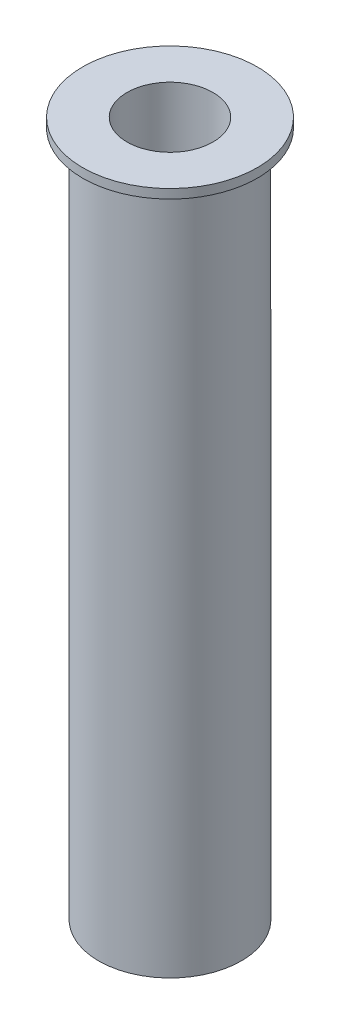
ISO-10303-21;
HEADER;
FILE_DESCRIPTION(('STEP AP214'),'2;1');
FILE_NAME('part.step','',(''),(''),'','','');
FILE_SCHEMA(('AUTOMOTIVE_DESIGN { 1 0 10303 214 1 1 1 1 }'));
ENDSEC;
DATA;
#1=APPLICATION_CONTEXT('core data for automotive mechanical design processes');
#2=APPLICATION_PROTOCOL_DEFINITION('international standard','automotive_design',2000,#1);
#3=PRODUCT_CONTEXT('',#1,'mechanical');
#4=PRODUCT('Part','Part','',(#3));
#5=PRODUCT_RELATED_PRODUCT_CATEGORY('part','',(#4));
#6=PRODUCT_DEFINITION_FORMATION('','',#4);
#7=PRODUCT_DEFINITION_CONTEXT('part definition',#1,'design');
#8=PRODUCT_DEFINITION('design','',#6,#7);
#9=PRODUCT_DEFINITION_SHAPE('','',#8);
#10=(LENGTH_UNIT() NAMED_UNIT(*) SI_UNIT(.MILLI.,.METRE.));
#11=(NAMED_UNIT(*) PLANE_ANGLE_UNIT() SI_UNIT($,.RADIAN.));
#12=(NAMED_UNIT(*) SI_UNIT($,.STERADIAN.) SOLID_ANGLE_UNIT());
#13=UNCERTAINTY_MEASURE_WITH_UNIT(LENGTH_MEASURE(1.E-05),#10,'distance_accuracy_value','');
#14=(GEOMETRIC_REPRESENTATION_CONTEXT(3) GLOBAL_UNCERTAINTY_ASSIGNED_CONTEXT((#13)) GLOBAL_UNIT_ASSIGNED_CONTEXT((#10,
#11,#12)) REPRESENTATION_CONTEXT('',''));
#15=CARTESIAN_POINT('',(0.,0.,0.));
#16=DIRECTION('',(0.,0.,1.));
#17=DIRECTION('',(1.,0.,0.));
#18=AXIS2_PLACEMENT_3D('',#15,#16,#17);
#19=CARTESIAN_POINT('',(0.,22.606,0.));
#20=DIRECTION('',(0.,-1.,0.));
#21=DIRECTION('',(0.,0.,-1.));
#22=AXIS2_PLACEMENT_3D('',#19,#20,#21);
#23=CYLINDRICAL_SURFACE('',#22,1.9812);
#24=CARTESIAN_POINT('',(0.,22.1060655575158,1.9812));
#25=CARTESIAN_POINT('',(0.259338466578053,22.1060655575158,1.9812));
#26=CARTESIAN_POINT('',(0.518574914937336,22.1060655575158,1.92963466434577));
#27=CARTESIAN_POINT('',(0.997769917466095,22.1060655575158,1.73114559527695));
#28=CARTESIAN_POINT('',(1.21753996654691,22.1060655575158,1.58429994322666));
#29=CARTESIAN_POINT('',(1.58429994322666,22.1060655575158,1.21753996654691));
#30=CARTESIAN_POINT('',(1.73114559527701,22.1060655575158,0.99776991746596));
#31=CARTESIAN_POINT('',(1.92963466434572,22.1060655575158,0.51857491493747));
#32=CARTESIAN_POINT('',(1.9812,22.1060655575158,0.259338466578004));
#33=CARTESIAN_POINT('',(1.9812,22.1060655575158,-0.259338466578004));
#34=CARTESIAN_POINT('',(1.92963466434574,22.1060655575158,-0.518574914937414));
#35=CARTESIAN_POINT('',(1.73114559527698,22.1060655575158,-0.997769917466019));
#36=CARTESIAN_POINT('',(1.58429994322661,22.1060655575158,-1.21753996654697));
#37=CARTESIAN_POINT('',(1.21753996654697,22.1060655575158,-1.58429994322661));
#38=CARTESIAN_POINT('',(0.997769917466048,22.1060655575158,-1.73114559527697));
#39=CARTESIAN_POINT('',(0.518574914937389,22.1060655575158,-1.92963466434575));
#40=CARTESIAN_POINT('',(0.259338466578004,22.1060655575158,-1.9812));
#41=CARTESIAN_POINT('',(-0.259338466578004,22.1060655575158,-1.9812));
#42=CARTESIAN_POINT('',(-0.518574914937353,22.1060655575158,-1.92963466434576));
#43=CARTESIAN_POINT('',(-0.997769917466073,22.1060655575158,-1.73114559527696));
#44=CARTESIAN_POINT('',(-1.21753996654693,22.1060655575158,-1.58429994322664));
#45=CARTESIAN_POINT('',(-1.58429994322664,22.1060655575158,-1.21753996654693));
#46=CARTESIAN_POINT('',(-1.73114559527698,22.1060655575158,-0.997769917466033));
#47=CARTESIAN_POINT('',(-1.92963466434574,22.1060655575158,-0.518574914937403));
#48=CARTESIAN_POINT('',(-1.9812,22.1060655575158,-0.259338466578001));
#49=CARTESIAN_POINT('',(-1.9812,22.1060655575158,0.259338466578007));
#50=CARTESIAN_POINT('',(-1.92963466434576,22.1060655575158,0.518574914937352));
#51=CARTESIAN_POINT('',(-1.73114559527696,22.1060655575158,0.997769917466073));
#52=CARTESIAN_POINT('',(-1.58429994322663,22.1060655575158,1.21753996654695));
#53=CARTESIAN_POINT('',(-1.21753996654696,22.1060655575158,1.58429994322662));
#54=CARTESIAN_POINT('',(-0.997769917466078,22.1060655575158,1.73114559527696));
#55=CARTESIAN_POINT('',(-0.518574914937358,22.1060655575158,1.92963466434576));
#56=CARTESIAN_POINT('',(-0.259338466578054,22.1060655575158,1.9812));
#57=CARTESIAN_POINT('',(0.,22.1060655575158,1.9812));
#58=(BOUNDED_CURVE() B_SPLINE_CURVE(3,(#24,#25,#26,#27,#28,#29,#30,#31,#32,#33,#34,#35,#36,#37,
#38,#39,#40,#41,#42,#43,#44,#45,#46,#47,#48,#49,#50,#51,#52,#53,#54,#55,#56,#57),.UNSPECIFIED.,
.T.,.F.) B_SPLINE_CURVE_WITH_KNOTS((4,2,2,2,2,2,2,2,2,2,2,2,2,2,2,2,4),(0.,0.392699081698724,
0.785398163397448,1.17809724509617,1.5707963267949,1.96349540849362,2.35619449019234,
2.74889357189107,3.14159265358979,3.53429173528852,3.92699081698724,4.31968989868597,
4.71238898038469,5.10508806208341,5.49778714378214,5.89048622548086,6.28318530717959),
.UNSPECIFIED.) CURVE() GEOMETRIC_REPRESENTATION_ITEM() RATIONAL_B_SPLINE_CURVE((0.999999999999983,
0.999999999999983,0.999999999999983,0.999999999999983,0.999999999999983,0.999999999999983,
0.999999999999983,0.999999999999983,0.999999999999983,0.999999999999983,0.999999999999983,
0.999999999999983,0.999999999999983,0.999999999999983,0.999999999999983,0.999999999999983,
0.999999999999983,0.999999999999983,0.999999999999983,0.999999999999983,0.999999999999983,
0.999999999999983,0.999999999999983,0.999999999999983,0.999999999999983,0.999999999999983,
0.999999999999983,0.999999999999983,0.999999999999983,0.999999999999983,0.999999999999983,
0.999999999999983,0.999999999999983,0.999999999999983)) REPRESENTATION_ITEM(''));
#59=CARTESIAN_POINT('',(0.,22.1060655575158,1.9812));
#60=VERTEX_POINT('',#59);
#61=EDGE_CURVE('E11',#60,#60,#58,.F.);
#62=ORIENTED_EDGE('',*,*,#61,.T.);
#63=EDGE_LOOP('',(#62));
#64=FACE_BOUND('',#63,.T.);
#65=CARTESIAN_POINT('',(0.,3.302,0.));
#66=DIRECTION('',(0.,1.,0.));
#67=DIRECTION('',(0.,0.,1.));
#68=AXIS2_PLACEMENT_3D('',#65,#66,#67);
#69=CIRCLE('',#68,1.9812);
#70=CARTESIAN_POINT('',(0.,3.302,1.9812));
#71=VERTEX_POINT('',#70);
#72=EDGE_CURVE('E54',#71,#71,#69,.T.);
#73=ORIENTED_EDGE('',*,*,#72,.T.);
#74=EDGE_LOOP('',(#73));
#75=FACE_BOUND('',#74,.T.);
#76=ADVANCED_FACE('F40',(#64,#75),#23,.T.);
#77=CARTESIAN_POINT('',(0.,22.606,0.));
#78=DIRECTION('',(0.,1.,0.));
#79=DIRECTION('',(0.,0.,1.));
#80=AXIS2_PLACEMENT_3D('',#77,#78,#79);
#81=PLANE('',#80);
#82=CARTESIAN_POINT('',(0.,22.606,0.));
#83=DIRECTION('',(0.,1.,0.));
#84=DIRECTION('',(0.,0.,1.));
#85=AXIS2_PLACEMENT_3D('',#82,#83,#84);
#86=CIRCLE('',#85,1.1938);
#87=CARTESIAN_POINT('',(0.,22.606,-1.1938));
#88=VERTEX_POINT('',#87);
#89=EDGE_CURVE('E59',#88,#88,#86,.F.);
#90=ORIENTED_EDGE('',*,*,#89,.T.);
#91=EDGE_LOOP('',(#90));
#92=FACE_BOUND('',#91,.T.);
#93=CARTESIAN_POINT('',(0.,22.606,0.));
#94=DIRECTION('',(0.,1.,0.));
#95=DIRECTION('',(0.,0.,1.));
#96=AXIS2_PLACEMENT_3D('',#93,#94,#95);
#97=CIRCLE('',#96,2.4257);
#98=CARTESIAN_POINT('',(0.,22.606,2.4257));
#99=VERTEX_POINT('',#98);
#100=EDGE_CURVE('E105',#99,#99,#97,.T.);
#101=ORIENTED_EDGE('',*,*,#100,.T.);
#102=EDGE_LOOP('',(#101));
#103=FACE_BOUND('',#102,.T.);
#104=ADVANCED_FACE('F81',(#92,#103),#81,.T.);
#105=CARTESIAN_POINT('',(0.,3.302,0.));
#106=DIRECTION('',(0.,1.,0.));
#107=DIRECTION('',(0.,0.,1.));
#108=AXIS2_PLACEMENT_3D('',#105,#106,#107);
#109=PLANE('',#108);
#110=CARTESIAN_POINT('',(0.,3.302,0.));
#111=DIRECTION('',(0.,-1.,0.));
#112=DIRECTION('',(0.,0.,-1.));
#113=AXIS2_PLACEMENT_3D('',#110,#111,#112);
#114=CIRCLE('',#113,1.1938);
#115=CARTESIAN_POINT('',(0.,3.302,-1.1938));
#116=VERTEX_POINT('',#115);
#117=EDGE_CURVE('E64',#116,#116,#114,.T.);
#118=ORIENTED_EDGE('',*,*,#117,.F.);
#119=EDGE_LOOP('',(#118));
#120=FACE_BOUND('',#119,.T.);
#121=ORIENTED_EDGE('',*,*,#72,.F.);
#122=EDGE_LOOP('',(#121));
#123=FACE_BOUND('',#122,.T.);
#124=ADVANCED_FACE('F84',(#120,#123),#109,.F.);
#125=CARTESIAN_POINT('',(0.,25.982576301522,0.));
#126=DIRECTION('',(0.,-1.,0.));
#127=DIRECTION('',(0.,0.,-1.));
#128=AXIS2_PLACEMENT_3D('',#125,#126,#127);
#129=CYLINDRICAL_SURFACE('',#128,1.1938);
#130=CARTESIAN_POINT('',(0.,3.302,-1.1938));
#131=CARTESIAN_POINT('',(0.,3.50308333333334,-1.1938));
#132=CARTESIAN_POINT('',(0.,3.70416666666667,-1.1938));
#133=CARTESIAN_POINT('',(0.,4.10633333333334,-1.1938));
#134=CARTESIAN_POINT('',(0.,4.30741666666667,-1.1938));
#135=CARTESIAN_POINT('',(0.,4.70958333333334,-1.1938));
#136=CARTESIAN_POINT('',(0.,4.91066666666667,-1.1938));
#137=CARTESIAN_POINT('',(0.,5.31283333333334,-1.1938));
#138=CARTESIAN_POINT('',(0.,5.51391666666667,-1.1938));
#139=CARTESIAN_POINT('',(0.,5.91608333333333,-1.1938));
#140=CARTESIAN_POINT('',(0.,6.11716666666667,-1.1938));
#141=CARTESIAN_POINT('',(0.,6.51933333333333,-1.1938));
#142=CARTESIAN_POINT('',(0.,6.72041666666667,-1.1938));
#143=CARTESIAN_POINT('',(0.,7.12258333333333,-1.1938));
#144=CARTESIAN_POINT('',(0.,7.32366666666667,-1.1938));
#145=CARTESIAN_POINT('',(0.,7.72583333333334,-1.1938));
#146=CARTESIAN_POINT('',(0.,7.92691666666667,-1.1938));
#147=CARTESIAN_POINT('',(0.,8.32908333333334,-1.1938));
#148=CARTESIAN_POINT('',(0.,8.53016666666667,-1.1938));
#149=CARTESIAN_POINT('',(0.,8.93233333333334,-1.1938));
#150=CARTESIAN_POINT('',(0.,9.13341666666667,-1.1938));
#151=CARTESIAN_POINT('',(0.,9.53558333333334,-1.1938));
#152=CARTESIAN_POINT('',(0.,9.73666666666667,-1.1938));
#153=CARTESIAN_POINT('',(0.,10.1388333333333,-1.1938));
#154=CARTESIAN_POINT('',(0.,10.3399166666667,-1.1938));
#155=CARTESIAN_POINT('',(0.,10.7420833333333,-1.1938));
#156=CARTESIAN_POINT('',(0.,10.9431666666667,-1.1938));
#157=CARTESIAN_POINT('',(0.,11.3453333333333,-1.1938));
#158=CARTESIAN_POINT('',(0.,11.5464166666667,-1.1938));
#159=CARTESIAN_POINT('',(0.,11.9485833333333,-1.1938));
#160=CARTESIAN_POINT('',(0.,12.1496666666667,-1.1938));
#161=CARTESIAN_POINT('',(0.,12.5518333333333,-1.1938));
#162=CARTESIAN_POINT('',(0.,12.7529166666667,-1.1938));
#163=CARTESIAN_POINT('',(0.,13.1550833333333,-1.1938));
#164=CARTESIAN_POINT('',(0.,13.3561666666667,-1.1938));
#165=CARTESIAN_POINT('',(0.,13.7583333333333,-1.1938));
#166=CARTESIAN_POINT('',(0.,13.9594166666667,-1.1938));
#167=CARTESIAN_POINT('',(0.,14.3615833333333,-1.1938));
#168=CARTESIAN_POINT('',(0.,14.5626666666667,-1.1938));
#169=CARTESIAN_POINT('',(0.,14.9648333333333,-1.1938));
#170=CARTESIAN_POINT('',(0.,15.1659166666667,-1.1938));
#171=CARTESIAN_POINT('',(0.,15.5680833333333,-1.1938));
#172=CARTESIAN_POINT('',(0.,15.7691666666667,-1.1938));
#173=CARTESIAN_POINT('',(0.,16.1713333333333,-1.1938));
#174=CARTESIAN_POINT('',(0.,16.3724166666667,-1.1938));
#175=CARTESIAN_POINT('',(0.,16.7745833333333,-1.1938));
#176=CARTESIAN_POINT('',(0.,16.9756666666667,-1.1938));
#177=CARTESIAN_POINT('',(0.,17.3778333333333,-1.1938));
#178=CARTESIAN_POINT('',(0.,17.5789166666667,-1.1938));
#179=CARTESIAN_POINT('',(0.,17.9810833333333,-1.1938));
#180=CARTESIAN_POINT('',(0.,18.1821666666667,-1.1938));
#181=CARTESIAN_POINT('',(0.,18.5843333333333,-1.1938));
#182=CARTESIAN_POINT('',(0.,18.7854166666667,-1.1938));
#183=CARTESIAN_POINT('',(0.,19.1875833333333,-1.1938));
#184=CARTESIAN_POINT('',(0.,19.3886666666667,-1.1938));
#185=CARTESIAN_POINT('',(0.,19.7908333333333,-1.1938));
#186=CARTESIAN_POINT('',(0.,19.9919166666667,-1.1938));
#187=CARTESIAN_POINT('',(0.,20.3940833333333,-1.1938));
#188=CARTESIAN_POINT('',(0.,20.5951666666667,-1.1938));
#189=CARTESIAN_POINT('',(0.,20.9973333333333,-1.1938));
#190=CARTESIAN_POINT('',(0.,21.1984166666667,-1.1938));
#191=CARTESIAN_POINT('',(0.,21.6005833333333,-1.1938));
#192=CARTESIAN_POINT('',(0.,21.8016666666667,-1.1938));
#193=CARTESIAN_POINT('',(0.,22.2038333333333,-1.1938));
#194=CARTESIAN_POINT('',(0.,22.4049166666667,-1.1938));
#195=CARTESIAN_POINT('',(0.,22.606,-1.1938));
#196=B_SPLINE_CURVE_WITH_KNOTS('',3,(#130,#131,#132,#133,#134,#135,#136,#137,#138,#139,#140,
#141,#142,#143,#144,#145,#146,#147,#148,#149,#150,#151,#152,#153,#154,#155,#156,#157,#158,#159,
#160,#161,#162,#163,#164,#165,#166,#167,#168,#169,#170,#171,#172,#173,#174,#175,#176,#177,#178,
#179,#180,#181,#182,#183,#184,#185,#186,#187,#188,#189,#190,#191,#192,#193,#194,#195),
.UNSPECIFIED.,.F.,.F.,(4,2,2,2,2,2,2,2,2,2,2,2,2,2,2,2,2,2,2,2,2,2,2,2,2,2,2,2,2,2,2,2,4),(0.,
0.60325,1.2065,1.80975,2.413,3.01625,3.6195,4.22275,4.826,5.42925,6.0325,6.63575,7.239,7.84225,
8.4455,9.04875,9.652,10.25525,10.8585,11.46175,12.065,12.66825,13.2715,13.87475,14.478,15.08125,
15.6845,16.28775,16.891,17.49425,18.0975,18.70075,19.304),.UNSPECIFIED.);
#197=EDGE_CURVE('BSEAM88',#116,#88,#196,.T.);
#198=ORIENTED_EDGE('',*,*,#117,.T.);
#199=ORIENTED_EDGE('',*,*,#89,.F.);
#200=ORIENTED_EDGE('',*,*,#197,.T.);
#201=ORIENTED_EDGE('',*,*,#197,.F.);
#202=EDGE_LOOP('',(#198,#200,#199,#201));
#203=FACE_BOUND('',#202,.T.);
#204=ADVANCED_FACE('F88',(#203),#129,.F.);
#205=CARTESIAN_POINT('',(0.,22.352,0.));
#206=DIRECTION('',(0.,1.,0.));
#207=DIRECTION('',(0.,0.,1.));
#208=AXIS2_PLACEMENT_3D('',#205,#206,#207);
#209=CYLINDRICAL_SURFACE('',#208,2.4257);
#210=CARTESIAN_POINT('',(0.,22.352,2.4257));
#211=CARTESIAN_POINT('',(-0.317523378951335,22.352,2.4257));
#212=CARTESIAN_POINT('',(-0.63492185098102,22.352,2.36256551852591));
#213=CARTESIAN_POINT('',(-1.22162855279498,22.352,2.11954364549934));
#214=CARTESIAN_POINT('',(-1.49070598468248,22.352,1.93975185356591));
#215=CARTESIAN_POINT('',(-1.93975185356595,22.352,1.4907059846825));
#216=CARTESIAN_POINT('',(-2.11954364549935,22.352,1.22162855279501));
#217=CARTESIAN_POINT('',(-2.36256551852591,22.352,0.634921850980978));
#218=CARTESIAN_POINT('',(-2.4257,22.352,0.317523378951278));
#219=CARTESIAN_POINT('',(-2.4257,22.352,-0.31752337895127));
#220=CARTESIAN_POINT('',(-2.36256551852584,22.352,-0.63492185098102));
#221=CARTESIAN_POINT('',(-2.11954364549942,22.352,-1.22162855279498));
#222=CARTESIAN_POINT('',(-1.93975185356591,22.352,-1.49070598468247));
#223=CARTESIAN_POINT('',(-1.49070598468251,22.352,-1.93975185356594));
#224=CARTESIAN_POINT('',(-1.22162855279499,22.352,-2.11954364549935));
#225=CARTESIAN_POINT('',(-0.634921850980996,22.352,-2.36256551852591));
#226=CARTESIAN_POINT('',(-0.317523378951274,22.352,-2.4257));
#227=CARTESIAN_POINT('',(0.317523378951274,22.352,-2.4257));
#228=CARTESIAN_POINT('',(0.634921850981056,22.352,-2.36256551852591));
#229=CARTESIAN_POINT('',(1.22162855279495,22.352,-2.11954364549934));
#230=CARTESIAN_POINT('',(1.49070598468247,22.352,-1.93975185356591));
#231=CARTESIAN_POINT('',(1.93975185356594,22.352,-1.49070598468251));
#232=CARTESIAN_POINT('',(2.11954364549942,22.352,-1.22162855279496));
#233=CARTESIAN_POINT('',(2.36256551852584,22.352,-0.634921850981035));
#234=CARTESIAN_POINT('',(2.4257,22.352,-0.317523378951274));
#235=CARTESIAN_POINT('',(2.4257,22.352,0.317523378951274));
#236=CARTESIAN_POINT('',(2.36256551852584,22.352,0.634921850981122));
#237=CARTESIAN_POINT('',(2.11954364549942,22.352,1.22162855279487));
#238=CARTESIAN_POINT('',(1.93975185356592,22.352,1.49070598468246));
#239=CARTESIAN_POINT('',(1.4907059846825,22.352,1.93975185356595));
#240=CARTESIAN_POINT('',(1.22162855279502,22.352,2.11954364549931));
#241=CARTESIAN_POINT('',(0.634921850980974,22.352,2.36256551852595));
#242=CARTESIAN_POINT('',(0.317523378951335,22.352,2.4257));
#243=CARTESIAN_POINT('',(0.,22.352,2.4257));
#244=(BOUNDED_CURVE() B_SPLINE_CURVE(3,(#210,#211,#212,#213,#214,#215,#216,#217,#218,#219,#220,
#221,#222,#223,#224,#225,#226,#227,#228,#229,#230,#231,#232,#233,#234,#235,#236,#237,#238,#239,
#240,#241,#242,#243),.UNSPECIFIED.,.T.,.F.) B_SPLINE_CURVE_WITH_KNOTS((4,2,2,2,2,2,2,2,2,2,2,2,
2,2,2,2,4),(0.,0.392699081698725,0.785398163397448,1.17809724509617,1.5707963267949,
1.96349540849362,2.35619449019234,2.74889357189107,3.14159265358979,3.53429173528852,
3.92699081698724,4.31968989868597,4.71238898038469,5.10508806208341,5.49778714378214,
5.89048622548086,6.28318530717959),
.UNSPECIFIED.) CURVE() GEOMETRIC_REPRESENTATION_ITEM() RATIONAL_B_SPLINE_CURVE((1.,1.,1.,1.,1.,
1.,1.,1.,1.,1.,1.,1.,1.,1.,1.,1.,1.,1.,1.,1.,1.,1.,1.,1.,1.,1.,1.,1.,1.,1.,1.,1.,1.,1.)) REPRESENTATION_ITEM(''));
#245=CARTESIAN_POINT('',(0.,22.352,2.4257));
#246=VERTEX_POINT('',#245);
#247=EDGE_CURVE('E102',#246,#246,#244,.F.);
#248=ORIENTED_EDGE('',*,*,#247,.T.);
#249=EDGE_LOOP('',(#248));
#250=FACE_BOUND('',#249,.T.);
#251=ORIENTED_EDGE('',*,*,#100,.F.);
#252=EDGE_LOOP('',(#251));
#253=FACE_BOUND('',#252,.T.);
#254=ADVANCED_FACE('F91',(#250,#253),#209,.T.);
#255=CARTESIAN_POINT('',(0.,22.352,2.4257));
#256=CARTESIAN_POINT('',(0.317523378951335,22.352,2.4257));
#257=CARTESIAN_POINT('',(0.634921850980974,22.352,2.36256551852595));
#258=CARTESIAN_POINT('',(1.22162855279502,22.352,2.11954364549931));
#259=CARTESIAN_POINT('',(1.4907059846825,22.352,1.93975185356595));
#260=CARTESIAN_POINT('',(1.93975185356592,22.352,1.49070598468246));
#261=CARTESIAN_POINT('',(2.11954364549942,22.352,1.22162855279487));
#262=CARTESIAN_POINT('',(2.36256551852584,22.352,0.634921850981122));
#263=CARTESIAN_POINT('',(2.4257,22.352,0.317523378951274));
#264=CARTESIAN_POINT('',(2.4257,22.352,-0.317523378951274));
#265=CARTESIAN_POINT('',(2.36256551852584,22.352,-0.634921850981035));
#266=CARTESIAN_POINT('',(2.11954364549942,22.352,-1.22162855279496));
#267=CARTESIAN_POINT('',(1.93975185356594,22.352,-1.49070598468251));
#268=CARTESIAN_POINT('',(1.49070598468247,22.352,-1.93975185356591));
#269=CARTESIAN_POINT('',(1.22162855279495,22.352,-2.11954364549934));
#270=CARTESIAN_POINT('',(0.634921850981056,22.352,-2.36256551852591));
#271=CARTESIAN_POINT('',(0.317523378951274,22.352,-2.4257));
#272=CARTESIAN_POINT('',(-0.317523378951274,22.352,-2.4257));
#273=CARTESIAN_POINT('',(-0.634921850980996,22.352,-2.36256551852591));
#274=CARTESIAN_POINT('',(-1.22162855279499,22.352,-2.11954364549935));
#275=CARTESIAN_POINT('',(-1.49070598468251,22.352,-1.93975185356594));
#276=CARTESIAN_POINT('',(-1.93975185356591,22.352,-1.49070598468247));
#277=CARTESIAN_POINT('',(-2.11954364549942,22.352,-1.22162855279498));
#278=CARTESIAN_POINT('',(-2.36256551852584,22.352,-0.63492185098102));
#279=CARTESIAN_POINT('',(-2.4257,22.352,-0.31752337895127));
#280=CARTESIAN_POINT('',(-2.4257,22.352,0.317523378951278));
#281=CARTESIAN_POINT('',(-2.36256551852591,22.352,0.634921850980978));
#282=CARTESIAN_POINT('',(-2.11954364549935,22.352,1.22162855279501));
#283=CARTESIAN_POINT('',(-1.93975185356595,22.352,1.4907059846825));
#284=CARTESIAN_POINT('',(-1.49070598468248,22.352,1.93975185356591));
#285=CARTESIAN_POINT('',(-1.22162855279498,22.352,2.11954364549934));
#286=CARTESIAN_POINT('',(-0.63492185098102,22.352,2.36256551852591));
#287=CARTESIAN_POINT('',(-0.317523378951335,22.352,2.4257));
#288=CARTESIAN_POINT('',(0.,22.352,2.4257));
#289=CARTESIAN_POINT('',(0.,22.2372305935074,1.9812));
#290=CARTESIAN_POINT('',(0.259338466578053,22.2372305935074,1.9812));
#291=CARTESIAN_POINT('',(0.518574914937358,22.2372305935074,1.92963466434579));
#292=CARTESIAN_POINT('',(0.997769917466073,22.2372305935074,1.73114559527694));
#293=CARTESIAN_POINT('',(1.21753996654693,22.2372305935074,1.58429994322668));
#294=CARTESIAN_POINT('',(1.58429994322664,22.2372305935074,1.2175399665469));
#295=CARTESIAN_POINT('',(1.73114559527698,22.2372305935074,0.997769917465962));
#296=CARTESIAN_POINT('',(1.92963466434575,22.2372305935074,0.518574914937467));
#297=CARTESIAN_POINT('',(1.9812,22.2372305935074,0.259338466578004));
#298=CARTESIAN_POINT('',(1.9812,22.2372305935074,-0.259338466578004));
#299=CARTESIAN_POINT('',(1.92963466434571,22.2372305935074,-0.518574914937415));
#300=CARTESIAN_POINT('',(1.73114559527701,22.2372305935074,-0.997769917466017));
#301=CARTESIAN_POINT('',(1.58429994322662,22.237230593508,-1.21753996654699));
#302=CARTESIAN_POINT('',(1.21753996654695,22.2372305935068,-1.58429994322659));
#303=CARTESIAN_POINT('',(0.997769917466037,22.2372305935074,-1.73114559527694));
#304=CARTESIAN_POINT('',(0.5185749149374,22.2372305935074,-1.92963466434578));
#305=CARTESIAN_POINT('',(0.259338466578004,22.2372305935074,-1.9812));
#306=CARTESIAN_POINT('',(-0.259338466578004,22.2372305935074,-1.9812));
#307=CARTESIAN_POINT('',(-0.518574914937359,22.2372305935074,-1.92963466434585));
#308=CARTESIAN_POINT('',(-0.997769917466066,22.2372305935074,-1.73114559527687));
#309=CARTESIAN_POINT('',(-1.21753996654695,22.2372305935074,-1.58429994322666));
#310=CARTESIAN_POINT('',(-1.58429994322663,22.2372305935074,-1.21753996654691));
#311=CARTESIAN_POINT('',(-1.73114559527694,22.2372305935074,-0.997769917466019));
#312=CARTESIAN_POINT('',(-1.92963466434578,22.2372305935074,-0.518574914937417));
#313=CARTESIAN_POINT('',(-1.9812,22.2372305935074,-0.259338466578001));
#314=CARTESIAN_POINT('',(-1.9812,22.2372305935074,0.259338466578007));
#315=CARTESIAN_POINT('',(-1.92963466434585,22.2372305935074,0.518574914937359));
#316=CARTESIAN_POINT('',(-1.73114559527687,22.2372305935074,0.997769917466066));
#317=CARTESIAN_POINT('',(-1.58429994322663,22.237230593508,1.21753996654695));
#318=CARTESIAN_POINT('',(-1.21753996654696,22.2372305935068,1.58429994322662));
#319=CARTESIAN_POINT('',(-0.997769917466072,22.2372305935074,1.73114559527694));
#320=CARTESIAN_POINT('',(-0.518574914937365,22.2372305935074,1.92963466434578));
#321=CARTESIAN_POINT('',(-0.259338466578054,22.2372305935074,1.9812));
#322=CARTESIAN_POINT('',(0.,22.2372305935074,1.9812));
#323=CARTESIAN_POINT('',(0.,22.1060655575158,1.9812));
#324=CARTESIAN_POINT('',(0.259338466578053,22.1060655575158,1.9812));
#325=CARTESIAN_POINT('',(0.518574914937336,22.1060655575158,1.92963466434577));
#326=CARTESIAN_POINT('',(0.997769917466095,22.1060655575158,1.73114559527695));
#327=CARTESIAN_POINT('',(1.21753996654691,22.1060655575158,1.58429994322666));
#328=CARTESIAN_POINT('',(1.58429994322666,22.1060655575158,1.21753996654691));
#329=CARTESIAN_POINT('',(1.73114559527701,22.1060655575158,0.997769917465959));
#330=CARTESIAN_POINT('',(1.92963466434572,22.1060655575158,0.51857491493747));
#331=CARTESIAN_POINT('',(1.9812,22.1060655575158,0.259338466578004));
#332=CARTESIAN_POINT('',(1.9812,22.1060655575158,-0.259338466578004));
#333=CARTESIAN_POINT('',(1.92963466434574,22.1060655575158,-0.518574914937414));
#334=CARTESIAN_POINT('',(1.73114559527698,22.1060655575158,-0.997769917466018));
#335=CARTESIAN_POINT('',(1.58429994322661,22.1060655575158,-1.21753996654697));
#336=CARTESIAN_POINT('',(1.21753996654697,22.1060655575158,-1.58429994322661));
#337=CARTESIAN_POINT('',(0.997769917466048,22.1060655575158,-1.73114559527697));
#338=CARTESIAN_POINT('',(0.518574914937389,22.1060655575158,-1.92963466434575));
#339=CARTESIAN_POINT('',(0.259338466578004,22.1060655575158,-1.9812));
#340=CARTESIAN_POINT('',(-0.259338466578004,22.1060655575158,-1.9812));
#341=CARTESIAN_POINT('',(-0.518574914937353,22.1060655575158,-1.92963466434576));
#342=CARTESIAN_POINT('',(-0.997769917466073,22.1060655575158,-1.73114559527696));
#343=CARTESIAN_POINT('',(-1.21753996654693,22.1060655575158,-1.58429994322664));
#344=CARTESIAN_POINT('',(-1.58429994322664,22.1060655575158,-1.21753996654693));
#345=CARTESIAN_POINT('',(-1.73114559527698,22.1060655575158,-0.997769917466033));
#346=CARTESIAN_POINT('',(-1.92963466434574,22.1060655575158,-0.518574914937403));
#347=CARTESIAN_POINT('',(-1.9812,22.1060655575158,-0.259338466578001));
#348=CARTESIAN_POINT('',(-1.9812,22.1060655575158,0.259338466578007));
#349=CARTESIAN_POINT('',(-1.92963466434576,22.1060655575158,0.518574914937352));
#350=CARTESIAN_POINT('',(-1.73114559527696,22.1060655575158,0.997769917466073));
#351=CARTESIAN_POINT('',(-1.58429994322663,22.1060655575158,1.21753996654695));
#352=CARTESIAN_POINT('',(-1.21753996654696,22.1060655575158,1.58429994322662));
#353=CARTESIAN_POINT('',(-0.997769917466078,22.1060655575158,1.73114559527696));
#354=CARTESIAN_POINT('',(-0.518574914937358,22.1060655575158,1.92963466434576));
#355=CARTESIAN_POINT('',(-0.259338466578054,22.1060655575158,1.9812));
#356=CARTESIAN_POINT('',(0.,22.1060655575158,1.9812));
#357=(BOUNDED_SURFACE() B_SPLINE_SURFACE(2,3,((#255,#256,#257,#258,#259,#260,#261,#262,#263,
#264,#265,#266,#267,#268,#269,#270,#271,#272,#273,#274,#275,#276,#277,#278,#279,#280,#281,#282,
#283,#284,#285,#286,#287,#288),(#289,#290,#291,#292,#293,#294,#295,#296,#297,#298,#299,#300,
#301,#302,#303,#304,#305,#306,#307,#308,#309,#310,#311,#312,#313,#314,#315,#316,#317,#318,#319,
#320,#321,#322),(#323,#324,#325,#326,#327,#328,#329,#330,#331,#332,#333,#334,#335,#336,#337,
#338,#339,#340,#341,#342,#343,#344,#345,#346,#347,#348,#349,#350,#351,#352,#353,#354,#355,
#356)),.UNSPECIFIED.,.F.,.T.,.F.) B_SPLINE_SURFACE_WITH_KNOTS((3,3),(4,2,2,2,2,2,2,2,2,2,2,2,2,
2,2,2,4),(0.,1.),(0.,0.392699081698724,0.785398163397448,1.17809724509617,1.5707963267949,
1.96349540849362,2.35619449019234,2.74889357189107,3.14159265358979,3.53429173528852,
3.92699081698724,4.31968989868597,4.71238898038469,5.10508806208341,5.49778714378214,
5.89048622548086,6.28318530717959),
.UNSPECIFIED.) GEOMETRIC_REPRESENTATION_ITEM() RATIONAL_B_SPLINE_SURFACE(((1.,1.,1.,1.,1.,1.,1.,
1.,1.,1.,1.,1.,1.,1.,1.,1.,1.,1.,1.,1.,1.,1.,1.,1.,1.,1.,1.,1.,1.,1.,1.,1.,1.,1.),
(0.790569415042095,0.790569415042095,0.790569415042095,0.790569415042095,0.790569415042095,
0.790569415042095,0.790569415042095,0.790569415042095,0.790569415042095,0.790569415042095,
0.790569415042095,0.790569415042095,0.790569415042095,0.790569415042095,0.790569415042095,
0.790569415042095,0.790569415042095,0.790569415042095,0.790569415042095,0.790569415042095,
0.790569415042095,0.790569415042095,0.790569415042095,0.790569415042095,0.790569415042095,
0.790569415042095,0.790569415042095,0.790569415042095,0.790569415042094,0.790569415042094,
0.790569415042095,0.790569415042095,0.790569415042095,0.790569415042095),(1.,1.,1.,1.,1.,1.,1.,
1.,1.,1.,1.,1.,1.,1.,1.,1.,1.,1.,1.,1.,1.,1.,1.,1.,1.,1.,1.,1.,1.,1.,1.,1.,1.,1.))) REPRESENTATION_ITEM('') SURFACE());
#358=ORIENTED_EDGE('',*,*,#61,.F.);
#359=EDGE_LOOP('',(#358));
#360=FACE_BOUND('',#359,.T.);
#361=ORIENTED_EDGE('',*,*,#247,.F.);
#362=EDGE_LOOP('',(#361));
#363=FACE_BOUND('',#362,.T.);
#364=ADVANCED_FACE('F43',(#360,#363),#357,.T.);
#365=CLOSED_SHELL('',(#76,#104,#124,#204,#254,#364));
#366=MANIFOLD_SOLID_BREP('B2',#365);
#367=ADVANCED_BREP_SHAPE_REPRESENTATION('',(#18,#366),#14);
#368=SHAPE_DEFINITION_REPRESENTATION(#9,#367);
ENDSEC;
END-ISO-10303-21;
